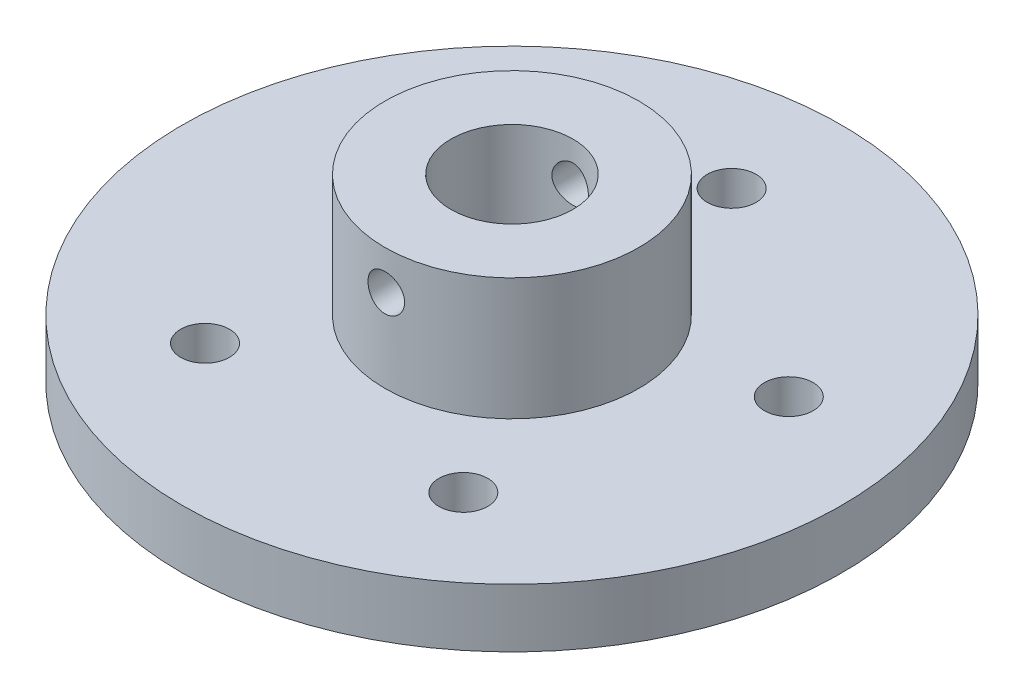
ISO-10303-21;
HEADER;
FILE_DESCRIPTION(('STEP AP214'),'2;1');
FILE_NAME('part.step','',(''),(''),'','','');
FILE_SCHEMA(('AUTOMOTIVE_DESIGN { 1 0 10303 214 1 1 1 1 }'));
ENDSEC;
DATA;
#1=APPLICATION_CONTEXT('core data for automotive mechanical design processes');
#2=APPLICATION_PROTOCOL_DEFINITION('international standard','automotive_design',2000,#1);
#3=PRODUCT_CONTEXT('',#1,'mechanical');
#4=PRODUCT('Part','Part','',(#3));
#5=PRODUCT_RELATED_PRODUCT_CATEGORY('part','',(#4));
#6=PRODUCT_DEFINITION_FORMATION('','',#4);
#7=PRODUCT_DEFINITION_CONTEXT('part definition',#1,'design');
#8=PRODUCT_DEFINITION('design','',#6,#7);
#9=PRODUCT_DEFINITION_SHAPE('','',#8);
#10=(LENGTH_UNIT() NAMED_UNIT(*) SI_UNIT(.MILLI.,.METRE.));
#11=(NAMED_UNIT(*) PLANE_ANGLE_UNIT() SI_UNIT($,.RADIAN.));
#12=(NAMED_UNIT(*) SI_UNIT($,.STERADIAN.) SOLID_ANGLE_UNIT());
#13=UNCERTAINTY_MEASURE_WITH_UNIT(LENGTH_MEASURE(1.E-05),#10,'distance_accuracy_value','');
#14=(GEOMETRIC_REPRESENTATION_CONTEXT(3) GLOBAL_UNCERTAINTY_ASSIGNED_CONTEXT((#13)) GLOBAL_UNIT_ASSIGNED_CONTEXT((#10,
#11,#12)) REPRESENTATION_CONTEXT('',''));
#15=CARTESIAN_POINT('',(0.,0.,0.));
#16=DIRECTION('',(0.,0.,1.));
#17=DIRECTION('',(1.,0.,0.));
#18=AXIS2_PLACEMENT_3D('',#15,#16,#17);
#19=CARTESIAN_POINT('',(0.,15.24,0.));
#20=DIRECTION('',(0.,1.,0.));
#21=DIRECTION('',(0.,0.,1.));
#22=AXIS2_PLACEMENT_3D('',#19,#20,#21);
#23=PLANE('',#22);
#24=CARTESIAN_POINT('',(-54.352879906268,15.24,-17.6603212285283));
#25=DIRECTION('',(0.,1.,0.));
#26=DIRECTION('',(0.,0.,1.));
#27=AXIS2_PLACEMENT_3D('',#24,#25,#26);
#28=CIRCLE('',#27,6.34999999999999);
#29=CARTESIAN_POINT('',(-54.352879906268,15.24,-11.3103212285283));
#30=VERTEX_POINT('',#29);
#31=EDGE_CURVE('E153',#30,#30,#28,.T.);
#32=ORIENTED_EDGE('',*,*,#31,.F.);
#33=EDGE_LOOP('',(#32));
#34=FACE_BOUND('',#33,.T.);
#35=CARTESIAN_POINT('',(0.,15.24,-57.15));
#36=DIRECTION('',(0.,1.,0.));
#37=DIRECTION('',(0.,0.,1.));
#38=AXIS2_PLACEMENT_3D('',#35,#36,#37);
#39=CIRCLE('',#38,6.34999999999999);
#40=CARTESIAN_POINT('',(0.,15.24,-50.8));
#41=VERTEX_POINT('',#40);
#42=EDGE_CURVE('E147',#41,#41,#39,.T.);
#43=ORIENTED_EDGE('',*,*,#42,.F.);
#44=EDGE_LOOP('',(#43));
#45=FACE_BOUND('',#44,.T.);
#46=CARTESIAN_POINT('',(54.352879906268,15.24,-17.6603212285283));
#47=DIRECTION('',(0.,1.,0.));
#48=DIRECTION('',(0.,0.,1.));
#49=AXIS2_PLACEMENT_3D('',#46,#47,#48);
#50=CIRCLE('',#49,6.34999999999999);
#51=CARTESIAN_POINT('',(54.352879906268,15.24,-11.3103212285283));
#52=VERTEX_POINT('',#51);
#53=EDGE_CURVE('E151',#52,#52,#50,.T.);
#54=ORIENTED_EDGE('',*,*,#53,.F.);
#55=EDGE_LOOP('',(#54));
#56=FACE_BOUND('',#55,.T.);
#57=CARTESIAN_POINT('',(33.5919271685148,15.24,46.2353212285282));
#58=DIRECTION('',(0.,1.,0.));
#59=DIRECTION('',(0.,0.,1.));
#60=AXIS2_PLACEMENT_3D('',#57,#58,#59);
#61=CIRCLE('',#60,6.34999999999999);
#62=CARTESIAN_POINT('',(33.5919271685148,15.24,52.5853212285282));
#63=VERTEX_POINT('',#62);
#64=EDGE_CURVE('E161',#63,#63,#61,.T.);
#65=ORIENTED_EDGE('',*,*,#64,.F.);
#66=EDGE_LOOP('',(#65));
#67=FACE_BOUND('',#66,.T.);
#68=CARTESIAN_POINT('',(-33.5919271685148,15.24,46.2353212285282));
#69=DIRECTION('',(0.,1.,0.));
#70=DIRECTION('',(0.,0.,1.));
#71=AXIS2_PLACEMENT_3D('',#68,#69,#70);
#72=CIRCLE('',#71,6.34999999999999);
#73=CARTESIAN_POINT('',(-33.5919271685148,15.24,52.5853212285282));
#74=VERTEX_POINT('',#73);
#75=EDGE_CURVE('E167',#74,#74,#72,.T.);
#76=ORIENTED_EDGE('',*,*,#75,.F.);
#77=EDGE_LOOP('',(#76));
#78=FACE_BOUND('',#77,.T.);
#79=CARTESIAN_POINT('',(0.,15.24,0.));
#80=DIRECTION('',(0.,1.,0.));
#81=DIRECTION('',(0.,0.,1.));
#82=AXIS2_PLACEMENT_3D('',#79,#80,#81);
#83=CIRCLE('',#82,85.725);
#84=CARTESIAN_POINT('',(0.,15.24,85.725));
#85=VERTEX_POINT('',#84);
#86=EDGE_CURVE('E61',#85,#85,#83,.T.);
#87=ORIENTED_EDGE('',*,*,#86,.T.);
#88=EDGE_LOOP('',(#87));
#89=FACE_BOUND('',#88,.T.);
#90=CARTESIAN_POINT('',(0.,15.24,0.));
#91=DIRECTION('',(0.,1.,0.));
#92=DIRECTION('',(0.,0.,1.));
#93=AXIS2_PLACEMENT_3D('',#90,#91,#92);
#94=CIRCLE('',#93,33.02);
#95=CARTESIAN_POINT('',(0.,15.24,33.02));
#96=VERTEX_POINT('',#95);
#97=EDGE_CURVE('E179',#96,#96,#94,.T.);
#98=ORIENTED_EDGE('',*,*,#97,.F.);
#99=EDGE_LOOP('',(#98));
#100=FACE_BOUND('',#99,.T.);
#101=ADVANCED_FACE('F43',(#34,#45,#56,#67,#78,#89,#100),#23,.T.);
#102=CARTESIAN_POINT('',(0.,7.80947580645162,0.));
#103=DIRECTION('',(0.,1.,0.));
#104=DIRECTION('',(0.,0.,1.));
#105=AXIS2_PLACEMENT_3D('',#102,#103,#104);
#106=CYLINDRICAL_SURFACE('',#105,85.725);
#107=ORIENTED_EDGE('',*,*,#86,.F.);
#108=EDGE_LOOP('',(#107));
#109=FACE_BOUND('',#108,.T.);
#110=CARTESIAN_POINT('',(0.,0.,0.));
#111=DIRECTION('',(0.,1.,0.));
#112=DIRECTION('',(0.,0.,1.));
#113=AXIS2_PLACEMENT_3D('',#110,#111,#112);
#114=CIRCLE('',#113,85.725);
#115=CARTESIAN_POINT('',(0.,0.,85.725));
#116=VERTEX_POINT('',#115);
#117=EDGE_CURVE('E56',#116,#116,#114,.T.);
#118=ORIENTED_EDGE('',*,*,#117,.T.);
#119=EDGE_LOOP('',(#118));
#120=FACE_BOUND('',#119,.T.);
#121=ADVANCED_FACE('F104',(#109,#120),#106,.T.);
#122=CARTESIAN_POINT('',(0.,0.,0.));
#123=DIRECTION('',(0.,1.,0.));
#124=DIRECTION('',(0.,0.,1.));
#125=AXIS2_PLACEMENT_3D('',#122,#123,#124);
#126=PLANE('',#125);
#127=CARTESIAN_POINT('',(-54.352879906268,0.,-17.6603212285283));
#128=DIRECTION('',(0.,1.,0.));
#129=DIRECTION('',(0.,0.,1.));
#130=AXIS2_PLACEMENT_3D('',#127,#128,#129);
#131=CIRCLE('',#130,6.34999999999999);
#132=CARTESIAN_POINT('',(-54.352879906268,0.,-11.3103212285283));
#133=VERTEX_POINT('',#132);
#134=EDGE_CURVE('E149',#133,#133,#131,.T.);
#135=ORIENTED_EDGE('',*,*,#134,.T.);
#136=EDGE_LOOP('',(#135));
#137=FACE_BOUND('',#136,.T.);
#138=CARTESIAN_POINT('',(0.,0.,-57.15));
#139=DIRECTION('',(0.,1.,0.));
#140=DIRECTION('',(0.,0.,1.));
#141=AXIS2_PLACEMENT_3D('',#138,#139,#140);
#142=CIRCLE('',#141,6.35);
#143=CARTESIAN_POINT('',(0.,0.,-50.8));
#144=VERTEX_POINT('',#143);
#145=EDGE_CURVE('E144',#144,#144,#142,.T.);
#146=ORIENTED_EDGE('',*,*,#145,.T.);
#147=EDGE_LOOP('',(#146));
#148=FACE_BOUND('',#147,.T.);
#149=CARTESIAN_POINT('',(54.352879906268,0.,-17.6603212285283));
#150=DIRECTION('',(0.,1.,0.));
#151=DIRECTION('',(0.,0.,1.));
#152=AXIS2_PLACEMENT_3D('',#149,#150,#151);
#153=CIRCLE('',#152,6.34999999999999);
#154=CARTESIAN_POINT('',(54.352879906268,0.,-11.3103212285283));
#155=VERTEX_POINT('',#154);
#156=EDGE_CURVE('E158',#155,#155,#153,.T.);
#157=ORIENTED_EDGE('',*,*,#156,.T.);
#158=EDGE_LOOP('',(#157));
#159=FACE_BOUND('',#158,.T.);
#160=CARTESIAN_POINT('',(33.5919271685148,0.,46.2353212285282));
#161=DIRECTION('',(0.,1.,0.));
#162=DIRECTION('',(0.,0.,1.));
#163=AXIS2_PLACEMENT_3D('',#160,#161,#162);
#164=CIRCLE('',#163,6.34999999999999);
#165=CARTESIAN_POINT('',(33.5919271685148,0.,52.5853212285282));
#166=VERTEX_POINT('',#165);
#167=EDGE_CURVE('E164',#166,#166,#164,.T.);
#168=ORIENTED_EDGE('',*,*,#167,.T.);
#169=EDGE_LOOP('',(#168));
#170=FACE_BOUND('',#169,.T.);
#171=CARTESIAN_POINT('',(-33.5919271685148,0.,46.2353212285282));
#172=DIRECTION('',(0.,1.,0.));
#173=DIRECTION('',(0.,0.,1.));
#174=AXIS2_PLACEMENT_3D('',#171,#172,#173);
#175=CIRCLE('',#174,6.34999999999999);
#176=CARTESIAN_POINT('',(-33.5919271685148,0.,52.5853212285282));
#177=VERTEX_POINT('',#176);
#178=EDGE_CURVE('E170',#177,#177,#175,.T.);
#179=ORIENTED_EDGE('',*,*,#178,.T.);
#180=EDGE_LOOP('',(#179));
#181=FACE_BOUND('',#180,.T.);
#182=ORIENTED_EDGE('',*,*,#117,.F.);
#183=EDGE_LOOP('',(#182));
#184=FACE_BOUND('',#183,.T.);
#185=CARTESIAN_POINT('',(0.,0.,0.));
#186=DIRECTION('',(0.,1.,0.));
#187=DIRECTION('',(0.,0.,1.));
#188=AXIS2_PLACEMENT_3D('',#185,#186,#187);
#189=CIRCLE('',#188,15.875);
#190=CARTESIAN_POINT('',(0.,0.,15.875));
#191=VERTEX_POINT('',#190);
#192=EDGE_CURVE('E10',#191,#191,#189,.T.);
#193=ORIENTED_EDGE('',*,*,#192,.T.);
#194=EDGE_LOOP('',(#193));
#195=FACE_BOUND('',#194,.T.);
#196=ADVANCED_FACE('F107',(#137,#148,#159,#170,#181,#184,#195),#126,.F.);
#197=CARTESIAN_POINT('',(0.,46.99,0.));
#198=DIRECTION('',(0.,1.,0.));
#199=DIRECTION('',(0.,0.,1.));
#200=AXIS2_PLACEMENT_3D('',#197,#198,#199);
#201=PLANE('',#200);
#202=CARTESIAN_POINT('',(0.,46.99,0.));
#203=DIRECTION('',(0.,1.,0.));
#204=DIRECTION('',(0.,0.,1.));
#205=AXIS2_PLACEMENT_3D('',#202,#203,#204);
#206=CIRCLE('',#205,33.02);
#207=CARTESIAN_POINT('',(0.,46.99,33.02));
#208=VERTEX_POINT('',#207);
#209=EDGE_CURVE('E176',#208,#208,#206,.T.);
#210=ORIENTED_EDGE('',*,*,#209,.T.);
#211=EDGE_LOOP('',(#210));
#212=FACE_BOUND('',#211,.T.);
#213=CARTESIAN_POINT('',(0.,46.99,0.));
#214=DIRECTION('',(0.,1.,0.));
#215=DIRECTION('',(0.,0.,1.));
#216=AXIS2_PLACEMENT_3D('',#213,#214,#215);
#217=CIRCLE('',#216,15.875);
#218=CARTESIAN_POINT('',(0.,46.99,15.875));
#219=VERTEX_POINT('',#218);
#220=EDGE_CURVE('E173',#219,#219,#217,.T.);
#221=ORIENTED_EDGE('',*,*,#220,.F.);
#222=EDGE_LOOP('',(#221));
#223=FACE_BOUND('',#222,.T.);
#224=ADVANCED_FACE('F98',(#212,#223),#201,.T.);
#225=CARTESIAN_POINT('',(0.,7.80947580645162,0.));
#226=DIRECTION('',(0.,1.,0.));
#227=DIRECTION('',(0.,0.,1.));
#228=AXIS2_PLACEMENT_3D('',#225,#226,#227);
#229=CYLINDRICAL_SURFACE('',#228,33.02);
#230=CARTESIAN_POINT('',(0.,32.0675,33.02));
#231=CARTESIAN_POINT('',(-0.26603094744688,32.0675110592998,33.0199958531323));
#232=CARTESIAN_POINT('',(-0.532219197204256,32.089865770711,33.0167512603797));
#233=CARTESIAN_POINT('',(-1.05716353278971,32.178675996113,33.0041201584808));
#234=CARTESIAN_POINT('',(-1.31591198729305,32.2451752176813,32.9947275623116));
#235=CARTESIAN_POINT('',(-1.81830310178529,32.4202530389781,32.9708566144752));
#236=CARTESIAN_POINT('',(-2.06195672055527,32.5288006864558,32.9563820044594));
#237=CARTESIAN_POINT('',(-2.52755116908513,32.7848203185796,32.9239490307575));
#238=CARTESIAN_POINT('',(-2.74949518132674,32.9322865862624,32.9059911788459));
#239=CARTESIAN_POINT('',(-3.16701771983894,33.2630966795248,32.8684451763602));
#240=CARTESIAN_POINT('',(-3.36241618035148,33.4466666809008,32.8488472203885));
#241=CARTESIAN_POINT('',(-3.71974804411932,33.8439868143039,32.8103071296905));
#242=CARTESIAN_POINT('',(-3.88167957921731,34.0577386299897,32.7913650316239));
#243=CARTESIAN_POINT('',(-4.16817485963279,34.5105553769822,32.7561859878388));
#244=CARTESIAN_POINT('',(-4.29256568139947,34.7497307856222,32.7399617092066));
#245=CARTESIAN_POINT('',(-4.49934365862681,35.2458517766804,32.7121882191762));
#246=CARTESIAN_POINT('',(-4.58173292959346,35.502796463367,32.7006387723252));
#247=CARTESIAN_POINT('',(-4.70161264763165,36.0252740402913,32.6836184655171));
#248=CARTESIAN_POINT('',(-4.73941042981103,36.2907350348289,32.6781060162727));
#249=CARTESIAN_POINT('',(-4.76998605984067,36.8242847789517,32.6736573767307));
#250=CARTESIAN_POINT('',(-4.76276630050625,37.0923733881152,32.6747208369042));
#251=CARTESIAN_POINT('',(-4.70376322244121,37.6214045079214,32.6832658157607));
#252=CARTESIAN_POINT('',(-4.65232126542665,37.882385998908,32.6906981700315));
#253=CARTESIAN_POINT('',(-4.50686797408299,38.3919738606286,32.7110667341879));
#254=CARTESIAN_POINT('',(-4.41285551895675,38.6405799053503,32.7240030889823));
#255=CARTESIAN_POINT('',(-4.18457195076634,39.1194038580301,32.7539767255185));
#256=CARTESIAN_POINT('',(-4.05015532539782,39.3495514287755,32.7710287851442));
#257=CARTESIAN_POINT('',(-3.74498275161219,39.7841536565799,32.8073016480313));
#258=CARTESIAN_POINT('',(-3.57422459571772,39.9886067516902,32.8265225830025));
#259=CARTESIAN_POINT('',(-3.19933791600927,40.3679955072814,32.8651850547283));
#260=CARTESIAN_POINT('',(-2.99491571313767,40.542641063757,32.8846269891812));
#261=CARTESIAN_POINT('',(-2.55950717887235,40.8551888217294,32.9213756729163));
#262=CARTESIAN_POINT('',(-2.3285207464682,40.9930908835026,32.9386824140789));
#263=CARTESIAN_POINT('',(-1.84629599386725,41.2282483924517,32.9692268618726));
#264=CARTESIAN_POINT('',(-1.59504712258958,41.32548249781,32.982462431064));
#265=CARTESIAN_POINT('',(-1.07955361476476,41.4762971920014,33.0033550671944));
#266=CARTESIAN_POINT('',(-0.815309791018889,41.5298805074076,33.0110124825602));
#267=CARTESIAN_POINT('',(-0.283832210004079,41.5914892382173,33.0198400986966));
#268=CARTESIAN_POINT('',(-0.0166456162986612,41.5999136815799,33.0210671168827));
#269=CARTESIAN_POINT('',(0.515326224970001,41.5720231690689,33.0170500401861));
#270=CARTESIAN_POINT('',(0.78011154089266,41.5357094908502,33.0118061301036));
#271=CARTESIAN_POINT('',(1.29856357922308,41.4197052970355,32.9954715797359));
#272=CARTESIAN_POINT('',(1.55227446362478,41.3402081667879,32.9844070126013));
#273=CARTESIAN_POINT('',(2.04276586419206,41.1402969231761,32.9576682130104));
#274=CARTESIAN_POINT('',(2.27954563723684,41.0198810151849,32.9419937783773));
#275=CARTESIAN_POINT('',(2.73121493288335,40.7406070390814,32.9076370616634));
#276=CARTESIAN_POINT('',(2.94594566492856,40.5814946161347,32.8889351636876));
#277=CARTESIAN_POINT('',(3.34579846162503,40.2296997489168,32.8506690021869));
#278=CARTESIAN_POINT('',(3.53091894077618,40.0370155081745,32.8311046925551));
#279=CARTESIAN_POINT('',(3.86773940370821,39.6217746830229,32.79313974191));
#280=CARTESIAN_POINT('',(4.01917261665001,39.399000650793,32.7747491588241));
#281=CARTESIAN_POINT('',(4.28246842934225,38.9309437754073,32.7413889753524));
#282=CARTESIAN_POINT('',(4.39433203361881,38.6856615038517,32.7264192881261));
#283=CARTESIAN_POINT('',(4.57489518897166,38.1803623358176,32.7016676679614));
#284=CARTESIAN_POINT('',(4.64373758653644,37.9203973608699,32.6918685837407));
#285=CARTESIAN_POINT('',(4.73676021913437,37.3924444098605,32.6785212045832));
#286=CARTESIAN_POINT('',(4.760943286463,37.1244569436807,32.6749725132469));
#287=CARTESIAN_POINT('',(4.76389719332539,36.5907238156289,32.6745417464125));
#288=CARTESIAN_POINT('',(4.74308737888128,36.3249804286565,32.6775981098639));
#289=CARTESIAN_POINT('',(4.65754225511338,35.800813755789,32.6898996441016));
#290=CARTESIAN_POINT('',(4.59280699563927,35.5423904615868,32.6991448078645));
#291=CARTESIAN_POINT('',(4.42139274281739,35.0403009584652,32.7227613333682));
#292=CARTESIAN_POINT('',(4.31474084229621,34.7966253345539,32.7371293833752));
#293=CARTESIAN_POINT('',(4.06256222996975,34.3305589582013,32.7693771127755));
#294=CARTESIAN_POINT('',(3.91703440322669,34.108168816463,32.7872568928792));
#295=CARTESIAN_POINT('',(3.58970308487681,33.6888521757943,32.8247122367423));
#296=CARTESIAN_POINT('',(3.40758843742756,33.4921697700559,32.8443014697537));
#297=CARTESIAN_POINT('',(3.01290991884172,33.1320057681314,32.8828527423314));
#298=CARTESIAN_POINT('',(2.80033895867458,32.9685319230697,32.9018146346091));
#299=CARTESIAN_POINT('',(2.34951978340651,32.6786919048045,32.9370838663177));
#300=CARTESIAN_POINT('',(2.1111468328138,32.552518095821,32.9533772578248));
#301=CARTESIAN_POINT('',(1.61647549441229,32.3421834481362,32.9813361511852));
#302=CARTESIAN_POINT('',(1.36019622166341,32.2579785657191,32.9930065019739));
#303=CARTESIAN_POINT('',(0.918934905598586,32.1533367677676,33.0077033125928));
#304=CARTESIAN_POINT('',(0.736692240807498,32.1211964377688,33.0122911914757));
#305=CARTESIAN_POINT('',(0.369658352183646,32.0782743293917,33.0184409592931));
#306=CARTESIAN_POINT('',(0.184867156559355,32.067492314799,33.0200028816935));
#307=CARTESIAN_POINT('',(0.,32.0675,33.02));
#308=B_SPLINE_CURVE_WITH_KNOTS('',3,(#230,#231,#232,#233,#234,#235,#236,#237,#238,#239,#240,
#241,#242,#243,#244,#245,#246,#247,#248,#249,#250,#251,#252,#253,#254,#255,#256,#257,#258,#259,
#260,#261,#262,#263,#264,#265,#266,#267,#268,#269,#270,#271,#272,#273,#274,#275,#276,#277,#278,
#279,#280,#281,#282,#283,#284,#285,#286,#287,#288,#289,#290,#291,#292,#293,#294,#295,#296,#297,
#298,#299,#300,#301,#302,#303,#304,#305,#306,#307),.UNSPECIFIED.,.T.,.F.,(4,2,2,2,2,2,2,2,2,2,2,
2,2,2,2,2,2,2,2,2,2,2,2,2,2,2,2,2,2,2,2,2,2,2,2,2,2,2,4),(0.,0.797417384518342,1.59562547368014,
2.39324710731692,3.19075163922141,3.99342121563534,4.79613558577488,5.60249295880238,
6.40880971374797,7.20953605857475,8.01021984279386,8.80477789479337,9.59935686715363,
10.3968324522872,11.1943564919567,11.9992474307743,12.8041414302891,13.6094572954252,
14.4147228540056,15.2128611386534,16.0109766301759,16.8055470950758,17.6001524129666,
18.4001290156715,19.2001484393106,20.0062939770324,20.8124190482298,21.6158530593678,
22.4192361149574,23.2151637194149,24.0110904205997,24.8065035182652,25.6019394303412,
26.4044507003281,27.2071490677199,28.0139176592743,28.8198378064629,29.3739760233614,
29.928108111683),.UNSPECIFIED.);
#309=CARTESIAN_POINT('',(0.,32.0675,33.02));
#310=VERTEX_POINT('',#309);
#311=EDGE_CURVE('E88',#310,#310,#308,.T.);
#312=ORIENTED_EDGE('',*,*,#311,.T.);
#313=EDGE_LOOP('',(#312));
#314=FACE_BOUND('',#313,.T.);
#315=CARTESIAN_POINT('',(4.7625,36.83,-32.6747455039821));
#316=CARTESIAN_POINT('',(4.76248892671494,37.0960147232058,-32.6747498148291));
#317=CARTESIAN_POINT('',(4.74013684985238,37.3621867933309,-32.6780291925627));
#318=CARTESIAN_POINT('',(4.6513380389032,37.887097518099,-32.6907844669982));
#319=CARTESIAN_POINT('',(4.58484753902549,38.1458285285696,-32.7002665138678));
#320=CARTESIAN_POINT('',(4.40979522546465,38.6481827367493,-32.724331319145));
#321=CARTESIAN_POINT('',(4.3012647767494,38.8918170409174,-32.7389102740869));
#322=CARTESIAN_POINT('',(4.04528566159547,39.3573790517352,-32.7715216876411));
#323=CARTESIAN_POINT('',(3.8978426707327,39.5793099174682,-32.7895536425122));
#324=CARTESIAN_POINT('',(3.56705622007763,39.9968469922957,-32.8271887690749));
#325=CARTESIAN_POINT('',(3.38348137280577,40.1922690441328,-32.84680155936));
#326=CARTESIAN_POINT('',(2.98614160115693,40.5496465279451,-32.8853024934538));
#327=CARTESIAN_POINT('',(2.77237505792614,40.711600164224,-32.9041905983364));
#328=CARTESIAN_POINT('',(2.31954510103581,40.998118801987,-32.9392141541201));
#329=CARTESIAN_POINT('',(2.0803737439672,41.122514871692,-32.9553370309259));
#330=CARTESIAN_POINT('',(1.58426154827203,41.329303664639,-32.9829071692124));
#331=CARTESIAN_POINT('',(1.32732157998348,41.411698443526,-32.9943546595125));
#332=CARTESIAN_POINT('',(0.80485969946539,41.5315893084504,-33.011216368692));
#333=CARTESIAN_POINT('',(0.539409807359531,41.5693933336912,-33.0166719488366));
#334=CARTESIAN_POINT('',(0.00588189416432446,41.599985298006,-33.0210767784087));
#335=CARTESIAN_POINT('',(-0.26219599062272,41.5927755595393,-33.0200263635092));
#336=CARTESIAN_POINT('',(-0.791270636687732,41.5337885949582,-33.0115707053716));
#337=CARTESIAN_POINT('',(-1.05230519277795,41.4823426333977,-33.0042126980105));
#338=CARTESIAN_POINT('',(-1.56199710726901,41.3368630354492,-32.9840212796801));
#339=CARTESIAN_POINT('',(-1.81065416673062,41.2428283710193,-32.9711877365382));
#340=CARTESIAN_POINT('',(-2.28954091960983,41.0144983149704,-32.9414059115004));
#341=CARTESIAN_POINT('',(-2.51970273830735,40.8800625092158,-32.9244433188121));
#342=CARTESIAN_POINT('',(-2.95432537795738,40.5748487271907,-32.8882956928444));
#343=CARTESIAN_POINT('',(-3.15878463188945,40.4040685368026,-32.8691105241971));
#344=CARTESIAN_POINT('',(-3.53814943071949,40.0291659120602,-32.8304532380743));
#345=CARTESIAN_POINT('',(-3.71276929175123,39.8247543747494,-32.8109800977407));
#346=CARTESIAN_POINT('',(-4.02527024245449,39.3893764453766,-32.7741122954539));
#347=CARTESIAN_POINT('',(-4.16315113701575,39.1584099122979,-32.7567176445394));
#348=CARTESIAN_POINT('',(-4.39829328535865,38.676191197694,-32.7259767831221));
#349=CARTESIAN_POINT('',(-4.49552677784585,38.424925291443,-32.7126333412044));
#350=CARTESIAN_POINT('',(-4.64633505620849,37.9093946610791,-32.6915558391299));
#351=CARTESIAN_POINT('',(-4.6999126760097,37.6451307819119,-32.6838214148668));
#352=CARTESIAN_POINT('',(-4.76149986330167,37.1136428581622,-32.6749061780347));
#353=CARTESIAN_POINT('',(-4.76991368200457,36.8464665975297,-32.6736672282496));
#354=CARTESIAN_POINT('',(-4.74200560793737,36.3145179499786,-32.6777290199197));
#355=CARTESIAN_POINT('',(-4.70568499513736,36.0497454944991,-32.6830295742623));
#356=CARTESIAN_POINT('',(-4.589681323807,35.5313626315813,-32.69951982148));
#357=CARTESIAN_POINT('',(-4.51019826837786,35.2777065277834,-32.7106823437785));
#358=CARTESIAN_POINT('',(-4.31033345307104,34.7873184859786,-32.7376164899943));
#359=CARTESIAN_POINT('',(-4.18994981443846,34.5505873260183,-32.7533883256342));
#360=CARTESIAN_POINT('',(-3.91072424956075,34.0989528023991,-32.7879015581588));
#361=CARTESIAN_POINT('',(-3.75161979612827,33.8842132986047,-32.8066629106931));
#362=CARTESIAN_POINT('',(-3.3998354539505,33.4843391090804,-32.8449805404706));
#363=CARTESIAN_POINT('',(-3.20715381414346,33.2992059682984,-32.8645368591308));
#364=CARTESIAN_POINT('',(-2.79190782242629,32.9623557808068,-32.9024218719099));
#365=CARTESIAN_POINT('',(-2.56912548799769,32.8109060847539,-32.9207399930129));
#366=CARTESIAN_POINT('',(-2.10104738612794,32.5475813828161,-32.9539219442797));
#367=CARTESIAN_POINT('',(-1.85575219639863,32.4357053617719,-32.9687858630487));
#368=CARTESIAN_POINT('',(-1.3504592755317,32.2551344830501,-32.9933381866221));
#369=CARTESIAN_POINT('',(-1.09051541035529,32.1862914063848,-33.0030443388818));
#370=CARTESIAN_POINT('',(-0.562607171692301,32.0932602711789,-33.0162618202885));
#371=CARTESIAN_POINT('',(-0.294643287281279,32.0690694952743,-33.0197735264045));
#372=CARTESIAN_POINT('',(0.239101257979842,32.0660921391002,-33.0202031601631));
#373=CARTESIAN_POINT('',(0.504879676239865,32.0868957260165,-33.0171806054753));
#374=CARTESIAN_POINT('',(1.02911801930895,32.1724406766587,-33.0050009025066));
#375=CARTESIAN_POINT('',(1.28757796251599,32.2371819299189,-32.9958437696489));
#376=CARTESIAN_POINT('',(1.78974441883794,32.4086230432947,-32.9724189550538));
#377=CARTESIAN_POINT('',(2.03346005406531,32.5152966476418,-32.9581544717601));
#378=CARTESIAN_POINT('',(2.49959746523598,32.7675311249817,-32.9260848390053));
#379=CARTESIAN_POINT('',(2.7220186553508,32.9130930674088,-32.9082795921762));
#380=CARTESIAN_POINT('',(3.14133624939167,33.2404630641886,-32.870916768272));
#381=CARTESIAN_POINT('',(3.33799466032525,33.4225744006905,-32.851345338175));
#382=CARTESIAN_POINT('',(3.69811178995425,33.8172362702669,-32.812760580252));
#383=CARTESIAN_POINT('',(3.86156269322982,34.029793948895,-32.7937473847057));
#384=CARTESIAN_POINT('',(4.1513766459789,34.480601185504,-32.7583266054874));
#385=CARTESIAN_POINT('',(4.27754355670651,34.718977904626,-32.7419330028861));
#386=CARTESIAN_POINT('',(4.48786427927328,35.2136569794163,-32.7137712958452));
#387=CARTESIAN_POINT('',(4.57206221044645,35.4699401864959,-32.7019983367959));
#388=CARTESIAN_POINT('',(4.67668541464194,35.9111831282774,-32.6871653651188));
#389=CARTESIAN_POINT('',(4.70881738982207,36.093402191327,-32.6825322353772));
#390=CARTESIAN_POINT('',(4.75172840695971,36.4603888650201,-32.6763208246471));
#391=CARTESIAN_POINT('',(4.7625076944063,36.6451564463391,-32.6747425085379));
#392=CARTESIAN_POINT('',(4.7625,36.83,-32.6747455039821));
#393=B_SPLINE_CURVE_WITH_KNOTS('',3,(#315,#316,#317,#318,#319,#320,#321,#322,#323,#324,#325,
#326,#327,#328,#329,#330,#331,#332,#333,#334,#335,#336,#337,#338,#339,#340,#341,#342,#343,#344,
#345,#346,#347,#348,#349,#350,#351,#352,#353,#354,#355,#356,#357,#358,#359,#360,#361,#362,#363,
#364,#365,#366,#367,#368,#369,#370,#371,#372,#373,#374,#375,#376,#377,#378,#379,#380,#381,#382,
#383,#384,#385,#386,#387,#388,#389,#390,#391,#392),.UNSPECIFIED.,.T.,.F.,(4,2,2,2,2,2,2,2,2,2,2,
2,2,2,2,2,2,2,2,2,2,2,2,2,2,2,2,2,2,2,2,2,2,2,2,2,2,2,4),(0.,0.797368638559685,1.59552909742427,
2.3930952118792,3.19054506182148,3.99327844544991,4.79605488733179,5.6023901474117,
6.4086859397003,7.20938031361456,8.01003337650202,8.80474242410945,9.59947065609325,
10.3969935519069,11.19456504712,11.9993899807593,12.8042191885107,13.6095971826434,
14.4149228914087,15.2130281380655,16.0111105493562,16.8055260315263,17.5999780098466,
18.399974258056,19.200012238835,20.0061899981291,20.8123470755379,21.6157119694644,
22.4190279721399,23.2150577769836,24.0110855805021,24.8066157464105,25.6021677917526,
26.4046165677084,27.2072539825598,28.0140415643541,28.8199792232169,29.3740468533396,
29.9281081133817),.UNSPECIFIED.);
#394=CARTESIAN_POINT('',(4.7625,36.83,-32.6747455039821));
#395=VERTEX_POINT('',#394);
#396=EDGE_CURVE('E82',#395,#395,#393,.T.);
#397=ORIENTED_EDGE('',*,*,#396,.T.);
#398=EDGE_LOOP('',(#397));
#399=FACE_BOUND('',#398,.T.);
#400=ORIENTED_EDGE('',*,*,#209,.F.);
#401=EDGE_LOOP('',(#400));
#402=FACE_BOUND('',#401,.T.);
#403=ORIENTED_EDGE('',*,*,#97,.T.);
#404=EDGE_LOOP('',(#403));
#405=FACE_BOUND('',#404,.T.);
#406=ADVANCED_FACE('F93',(#314,#399,#402,#405),#229,.T.);
#407=CARTESIAN_POINT('',(0.,7.80947580645162,0.));
#408=DIRECTION('',(0.,1.,0.));
#409=DIRECTION('',(0.,0.,1.));
#410=AXIS2_PLACEMENT_3D('',#407,#408,#409);
#411=CYLINDRICAL_SURFACE('',#410,15.875);
#412=CARTESIAN_POINT('',(0.,32.0675,15.875));
#413=CARTESIAN_POINT('',(-0.261266345491727,32.0675031670145,15.874997753705));
#414=CARTESIAN_POINT('',(-0.522564735766107,32.0890705170061,15.868488573283));
#415=CARTESIAN_POINT('',(-1.037552297843,32.1745652996552,15.8431581025997));
#416=CARTESIAN_POINT('',(-1.29123917650626,32.2385053667241,15.8243331401227));
#417=CARTESIAN_POINT('',(-1.78350134712062,32.4064186036901,15.7764337919333));
#418=CARTESIAN_POINT('',(-2.02209833195531,32.5103327110401,15.747374532951));
#419=CARTESIAN_POINT('',(-2.4784817748437,32.7550020954523,15.6820269682953));
#420=CARTESIAN_POINT('',(-2.69626545921621,32.8957622734804,15.6457377010982));
#421=CARTESIAN_POINT('',(-3.11109295605839,33.2143862237257,15.5686359058704));
#422=CARTESIAN_POINT('',(-3.30745487620077,33.3931152871878,15.5277306811104));
#423=CARTESIAN_POINT('',(-3.66791623931554,33.7807593049648,15.446560236182));
#424=CARTESIAN_POINT('',(-3.8320102533963,33.9896793284966,15.4062951247548));
#425=CARTESIAN_POINT('',(-4.12686619772767,34.4375446408945,15.3299831193004));
#426=CARTESIAN_POINT('',(-4.25679581145508,34.677059363646,15.2940514115709));
#427=CARTESIAN_POINT('',(-4.47425428409885,35.1757908821808,15.2318599475176));
#428=CARTESIAN_POINT('',(-4.56179332495993,35.4350029294698,15.2055978689741));
#429=CARTESIAN_POINT('',(-4.68952686942344,35.9581140949657,15.1666851490946));
#430=CARTESIAN_POINT('',(-4.73097848044824,36.2216787117735,15.1536739509592));
#431=CARTESIAN_POINT('',(-4.7692859470186,36.7523177709827,15.1416635746498));
#432=CARTESIAN_POINT('',(-4.76615260767456,37.019391347317,15.1426610015013));
#433=CARTESIAN_POINT('',(-4.71636652608321,37.5392439098608,15.1582356238118));
#434=CARTESIAN_POINT('',(-4.67128876705057,37.7921908949908,15.1723213367746));
#435=CARTESIAN_POINT('',(-4.54143809852037,38.2867528215045,15.2116903090124));
#436=CARTESIAN_POINT('',(-4.45666127148849,38.5283666419335,15.2369746733655));
#437=CARTESIAN_POINT('',(-4.24865884626643,38.9972561101451,15.2962842754707));
#438=CARTESIAN_POINT('',(-4.12492243767813,39.2242899915505,15.3304245117728));
#439=CARTESIAN_POINT('',(-3.84286831718747,39.6548991698898,15.4035438371607));
#440=CARTESIAN_POINT('',(-3.6845422245813,39.8584687633908,15.442524097942));
#441=CARTESIAN_POINT('',(-3.32998098180702,40.2453036556673,15.5229246087355));
#442=CARTESIAN_POINT('',(-3.13243883120789,40.4273660082936,15.5643787743653));
#443=CARTESIAN_POINT('',(-2.7091108483216,40.7560588994046,15.6436137490015));
#444=CARTESIAN_POINT('',(-2.48332323965825,40.9026872077159,15.6813943267077));
#445=CARTESIAN_POINT('',(-2.00772724673846,41.1570802538254,15.7493703322076));
#446=CARTESIAN_POINT('',(-1.75776810544976,41.2645781140933,15.7795132614695));
#447=CARTESIAN_POINT('',(-1.24220419454116,41.4356536985664,15.8284393181725));
#448=CARTESIAN_POINT('',(-0.976603811296916,41.4992436730907,15.8472256139371));
#449=CARTESIAN_POINT('',(-0.447523370471957,41.5786956648306,15.8708205774325));
#450=CARTESIAN_POINT('',(-0.18430905988377,41.5961880349201,15.8761065007649));
#451=CARTESIAN_POINT('',(0.341311248489243,41.5875179306141,15.8735053129258));
#452=CARTESIAN_POINT('',(0.60371734949323,41.5613612838567,15.8656199602688));
#453=CARTESIAN_POINT('',(1.11411894685829,41.467453859721,15.8378746293424));
#454=CARTESIAN_POINT('',(1.36230605304999,41.4006557444307,15.8182890961314));
#455=CARTESIAN_POINT('',(1.84389597868061,41.2285077359292,15.7694105439687));
#456=CARTESIAN_POINT('',(2.07729701705623,41.1231532087048,15.7401163581947));
#457=CARTESIAN_POINT('',(2.52868807653884,40.8741461995974,15.6740115256543));
#458=CARTESIAN_POINT('',(2.74619664818395,40.7296640924902,15.6370426663411));
#459=CARTESIAN_POINT('',(3.15443650283698,40.4075114058823,15.5598326332682));
#460=CARTESIAN_POINT('',(3.34516105273012,40.2298325072567,15.5195906406909));
#461=CARTESIAN_POINT('',(3.70159738949508,39.8386702959272,15.4385382068409));
#462=CARTESIAN_POINT('',(3.86614927910015,39.6241210444244,15.39776019479));
#463=CARTESIAN_POINT('',(4.15699559354097,39.1695687936323,15.3218043588374));
#464=CARTESIAN_POINT('',(4.28329102158607,38.9295664620287,15.2866263880958));
#465=CARTESIAN_POINT('',(4.49317577128726,38.4316843402653,15.2262582702177));
#466=CARTESIAN_POINT('',(4.57696401525009,38.1738943577424,15.2010217263168));
#467=CARTESIAN_POINT('',(4.69968995338111,37.6469656986465,15.1635331212433));
#468=CARTESIAN_POINT('',(4.73864301758085,37.3778309440139,15.1512766104765));
#469=CARTESIAN_POINT('',(4.76954800739764,36.8479021791168,15.1415741259472));
#470=CARTESIAN_POINT('',(4.76339075602721,36.5872279079181,15.1435323033688));
#471=CARTESIAN_POINT('',(4.70876329785669,36.070812721703,15.160605987976));
#472=CARTESIAN_POINT('',(4.66029478545935,35.8150716095519,15.1757209682824));
#473=CARTESIAN_POINT('',(4.52364121953789,35.3188733577569,15.2170054973042));
#474=CARTESIAN_POINT('',(4.43595682235119,35.0782658626361,15.2430354445408));
#475=CARTESIAN_POINT('',(4.22375035109409,34.6149852567442,15.3031913551586));
#476=CARTESIAN_POINT('',(4.09922122632084,34.392315588988,15.3373188678632));
#477=CARTESIAN_POINT('',(3.81154825081154,33.9624571050291,15.4113762265785));
#478=CARTESIAN_POINT('',(3.64716301595269,33.7561276829989,15.4514721502162));
#479=CARTESIAN_POINT('',(3.28667854949544,33.3733695678718,15.5321419242727));
#480=CARTESIAN_POINT('',(3.090571089402,33.1969486571897,15.5727158961547));
#481=CARTESIAN_POINT('',(2.66530379493185,32.8738756659635,15.6511922361225));
#482=CARTESIAN_POINT('',(2.43534528738519,32.7282446562339,15.6889818225613));
#483=CARTESIAN_POINT('',(1.95307386239769,32.4779158355547,15.7562766044709));
#484=CARTESIAN_POINT('',(1.70077146827168,32.3731988797284,15.7857856728111));
#485=CARTESIAN_POINT('',(1.20890573768052,32.2170574998025,15.8306190552756));
#486=CARTESIAN_POINT('',(0.970873604204693,32.1611254385957,15.847124369349));
#487=CARTESIAN_POINT('',(0.488569619857723,32.086348307358,15.8693149877001));
#488=CARTESIAN_POINT('',(0.244298818799592,32.0674970386622,15.875002100413));
#489=CARTESIAN_POINT('',(0.,32.0675,15.875));
#490=B_SPLINE_CURVE_WITH_KNOTS('',3,(#412,#413,#414,#415,#416,#417,#418,#419,#420,#421,#422,
#423,#424,#425,#426,#427,#428,#429,#430,#431,#432,#433,#434,#435,#436,#437,#438,#439,#440,#441,
#442,#443,#444,#445,#446,#447,#448,#449,#450,#451,#452,#453,#454,#455,#456,#457,#458,#459,#460,
#461,#462,#463,#464,#465,#466,#467,#468,#469,#470,#471,#472,#473,#474,#475,#476,#477,#478,#479,
#480,#481,#482,#483,#484,#485,#486,#487,#488,#489),.UNSPECIFIED.,.T.,.F.,(4,2,2,2,2,2,2,2,2,2,2,
2,2,2,2,2,2,2,2,2,2,2,2,2,2,2,2,2,2,2,2,2,2,2,2,2,2,2,4),(0.,0.782901671470039,1.56603688838605,
2.34801942225528,3.13010602201033,3.93241539360508,4.73485963391411,5.55534452188047,
6.37563223674736,7.17295013707201,7.97007481163109,8.73842603017835,9.50685308619295,
10.2858070397475,11.0649499350855,11.8766305535807,12.6883622449129,13.505530738545,
14.3224711495911,15.1101046997252,15.8976331002743,16.6673767072153,17.4372128584023,
18.2248589561188,19.0127027035575,19.8291577103009,20.645591305074,21.4581681247537,
22.2704663004154,23.0489174362008,23.827337399452,24.5960912829826,25.3649923725074,
26.161902390534,26.9590194531919,27.7794401281705,28.5994764433449,29.3316562189883,
30.063713588323),.UNSPECIFIED.);
#491=CARTESIAN_POINT('',(0.,32.0675,15.875));
#492=VERTEX_POINT('',#491);
#493=EDGE_CURVE('E48',#492,#492,#490,.T.);
#494=ORIENTED_EDGE('',*,*,#493,.F.);
#495=EDGE_LOOP('',(#494));
#496=FACE_BOUND('',#495,.T.);
#497=CARTESIAN_POINT('',(4.7625,36.83,-15.143784822494));
#498=CARTESIAN_POINT('',(4.76249674987405,37.0909676897198,-15.1437875218597));
#499=CARTESIAN_POINT('',(4.74097693430731,37.351967536658,-15.1506043891455));
#500=CARTESIAN_POINT('',(4.65568806118374,37.8663366674537,-15.1770263611095));
#501=CARTESIAN_POINT('',(4.59190488696096,38.119703372142,-15.1966357386656));
#502=CARTESIAN_POINT('',(4.42444991632123,38.6112852622629,-15.2462262539208));
#503=CARTESIAN_POINT('',(4.32084446326727,38.8495248840851,-15.2761901328282));
#504=CARTESIAN_POINT('',(4.07690389589421,39.305299640435,-15.3430901083847));
#505=CARTESIAN_POINT('',(3.93656328310142,39.5228316688231,-15.3800272485522));
#506=CARTESIAN_POINT('',(3.61838094399667,39.9379007900832,-15.4580228743982));
#507=CARTESIAN_POINT('',(3.43957932783187,40.1346857259795,-15.4991691638945));
#508=CARTESIAN_POINT('',(3.05160755431522,40.495975495449,-15.580196866492));
#509=CARTESIAN_POINT('',(2.84243349933903,40.6604761796784,-15.6200781164521));
#510=CARTESIAN_POINT('',(2.39430381499496,40.9557940719707,-15.6950795628956));
#511=CARTESIAN_POINT('',(2.15482176774121,41.0858443726059,-15.7300842478713));
#512=CARTESIAN_POINT('',(1.65615824904769,41.3035345474607,-15.7903683404817));
#513=CARTESIAN_POINT('',(1.39698104013162,41.3911835682974,-15.8156498453165));
#514=CARTESIAN_POINT('',(0.874153232102881,41.5190940034624,-15.8530177606139));
#515=CARTESIAN_POINT('',(0.610842691678317,41.5606392802973,-15.8654609464764));
#516=CARTESIAN_POINT('',(0.0807142904040691,41.5992225057524,-15.8770066476678));
#517=CARTESIAN_POINT('',(-0.186102822009932,41.5962698026012,-15.8761119650445));
#518=CARTESIAN_POINT('',(-0.706663422205502,41.5468026423759,-15.8613349212105));
#519=CARTESIAN_POINT('',(-0.960552649761227,41.5016785096537,-15.8478670915163));
#520=CARTESIAN_POINT('',(-1.45697325268006,41.3714205082181,-15.8099608270755));
#521=CARTESIAN_POINT('',(-1.69950390770017,41.2862841057568,-15.7855216975838));
#522=CARTESIAN_POINT('',(-2.16962776116519,41.0774768256463,-15.7278457663334));
#523=CARTESIAN_POINT('',(-2.39701408040447,40.9533686810879,-15.6945098122253));
#524=CARTESIAN_POINT('',(-2.82817783926203,40.6704868185394,-15.6225760905863));
#525=CARTESIAN_POINT('',(-3.0319496602209,40.5117048763374,-15.5839770755373));
#526=CARTESIAN_POINT('',(-3.41839702885516,40.1567721413673,-15.5038917279599));
#527=CARTESIAN_POINT('',(-3.59995654276612,39.9594167820944,-15.4623514513068));
#528=CARTESIAN_POINT('',(-3.92771793639682,39.5366556931853,-15.3823663615776));
#529=CARTESIAN_POINT('',(-4.07391630235831,39.3112471793376,-15.3439218563742));
#530=CARTESIAN_POINT('',(-4.3279693518785,38.8358396851754,-15.2742234259604));
#531=CARTESIAN_POINT('',(-4.43544290820137,38.5856256295572,-15.2430419874785));
#532=CARTESIAN_POINT('',(-4.60639677129299,38.069497113364,-15.1922604613002));
#533=CARTESIAN_POINT('',(-4.66989142981198,37.8035878054318,-15.1726565957717));
#534=CARTESIAN_POINT('',(-4.74899895648148,37.2742385046149,-15.1480789734703));
#535=CARTESIAN_POINT('',(-4.76630829757782,37.0110758891265,-15.1425871479299));
#536=CARTESIAN_POINT('',(-4.75729132464364,36.4855985424788,-15.1454228598876));
#537=CARTESIAN_POINT('',(-4.73097111878812,36.2232836977822,-15.1537484629337));
#538=CARTESIAN_POINT('',(-4.63695299348211,35.7140243999399,-15.1827724841554));
#539=CARTESIAN_POINT('',(-4.57034777544357,35.4668576784626,-15.2031438541227));
#540=CARTESIAN_POINT('',(-4.39891734349667,34.9872246316633,-15.2536252340815));
#541=CARTESIAN_POINT('',(-4.2940862283825,34.7547605826039,-15.2837367476479));
#542=CARTESIAN_POINT('',(-4.045961910489,34.3042320515708,-15.3513102619845));
#543=CARTESIAN_POINT('',(-3.90171191248417,34.08672151087,-15.3889478564668));
#544=CARTESIAN_POINT('',(-3.57998082581218,33.678374012876,-15.4669555292911));
#545=CARTESIAN_POINT('',(-3.40249178323296,33.4875434590794,-15.5073262601774));
#546=CARTESIAN_POINT('',(-3.01134504566719,33.1305522115382,-15.5880953651542));
#547=CARTESIAN_POINT('',(-2.79657513409736,32.9655943779663,-15.6284372807504));
#548=CARTESIAN_POINT('',(-2.34144116607404,32.6740307242369,-15.7030690430196));
#549=CARTESIAN_POINT('',(-2.10107838147702,32.5474229994439,-15.7373591902148));
#550=CARTESIAN_POINT('',(-1.60317022743907,32.3373749029456,-15.7958145625799));
#551=CARTESIAN_POINT('',(-1.34577017497014,32.2536120986952,-15.8200551462426));
#552=CARTESIAN_POINT('',(-0.819689643652059,32.1308065825229,-15.8560128521993));
#553=CARTESIAN_POINT('',(-0.551012415101356,32.0917510756138,-15.8677335575506));
#554=CARTESIAN_POINT('',(-0.0211205885777188,32.0604418351269,-15.8771127745843));
#555=CARTESIAN_POINT('',(0.239982943598664,32.0664436920801,-15.8752954372839));
#556=CARTESIAN_POINT('',(0.757299352697027,32.1209086831848,-15.8590381467654));
#557=CARTESIAN_POINT('',(1.01351250607539,32.1693694098006,-15.8445989092442));
#558=CARTESIAN_POINT('',(1.51109620640616,32.3062970249436,-15.8048695953749));
#559=CARTESIAN_POINT('',(1.75259659434009,32.3943287235598,-15.7796977045951));
#560=CARTESIAN_POINT('',(2.21752552986336,32.6075100785611,-15.7211059415099));
#561=CARTESIAN_POINT('',(2.44095109996279,32.7326658346616,-15.6876847139384));
#562=CARTESIAN_POINT('',(2.87115850843302,33.0211857273373,-15.6147759150177));
#563=CARTESIAN_POINT('',(3.07717904398516,33.1856442902407,-15.575128454715));
#564=CARTESIAN_POINT('',(3.45928178903196,33.5461304829683,-15.4947473065996));
#565=CARTESIAN_POINT('',(3.63535534551822,33.7421672053703,-15.4540133087578));
#566=CARTESIAN_POINT('',(3.95783655324734,34.1672569710954,-15.374641609628));
#567=CARTESIAN_POINT('',(4.10320362219627,34.397119906854,-15.3361025714441));
#568=CARTESIAN_POINT('',(4.3530619544192,34.8791376777983,-15.2670683818406));
#569=CARTESIAN_POINT('',(4.45757285891277,35.1312817298887,-15.2365693675568));
#570=CARTESIAN_POINT('',(4.61333667544683,35.6226758703835,-15.190083181138));
#571=CARTESIAN_POINT('',(4.6691187736135,35.8603824540149,-15.1728854162817));
#572=CARTESIAN_POINT('',(4.74369824800893,36.342050831415,-15.1497361023649));
#573=CARTESIAN_POINT('',(4.76250303866662,36.5860113612462,-15.1437822987541));
#574=CARTESIAN_POINT('',(4.7625,36.83,-15.143784822494));
#575=B_SPLINE_CURVE_WITH_KNOTS('',3,(#497,#498,#499,#500,#501,#502,#503,#504,#505,#506,#507,
#508,#509,#510,#511,#512,#513,#514,#515,#516,#517,#518,#519,#520,#521,#522,#523,#524,#525,#526,
#527,#528,#529,#530,#531,#532,#533,#534,#535,#536,#537,#538,#539,#540,#541,#542,#543,#544,#545,
#546,#547,#548,#549,#550,#551,#552,#553,#554,#555,#556,#557,#558,#559,#560,#561,#562,#563,#564,
#565,#566,#567,#568,#569,#570,#571,#572,#573,#574),.UNSPECIFIED.,.T.,.F.,(4,2,2,2,2,2,2,2,2,2,2,
2,2,2,2,2,2,2,2,2,2,2,2,2,2,2,2,2,2,2,2,2,2,2,2,2,2,2,4),(0.,0.78200302678185,1.56426738736258,
2.34523411593016,3.12631780555007,3.92979751275349,4.73338041991292,5.55358107193822,
6.3736047149151,7.17017044974846,7.96656884272074,8.73760400021045,9.50868798951945,
10.2887528964077,11.0690030267589,11.8793306679891,12.6897387966167,13.5079180643571,
14.3258302075348,15.113256565175,15.9005726917423,16.6674353893902,17.4344165232865,
18.2219832350308,19.009738648326,19.8272243187768,20.6446693826261,21.4558686901875,
22.2668357787961,23.046572649264,23.8262653093489,24.5975853257757,25.369032145184,
26.1651631590627,26.9615238210817,27.7816195595954,28.6013205584787,29.3325916350974,
30.063716067439),.UNSPECIFIED.);
#576=CARTESIAN_POINT('',(4.7625,36.83,-15.143784822494));
#577=VERTEX_POINT('',#576);
#578=EDGE_CURVE('E64',#577,#577,#575,.T.);
#579=ORIENTED_EDGE('',*,*,#578,.F.);
#580=EDGE_LOOP('',(#579));
#581=FACE_BOUND('',#580,.T.);
#582=ORIENTED_EDGE('',*,*,#220,.T.);
#583=EDGE_LOOP('',(#582));
#584=FACE_BOUND('',#583,.T.);
#585=ORIENTED_EDGE('',*,*,#192,.F.);
#586=EDGE_LOOP('',(#585));
#587=FACE_BOUND('',#586,.T.);
#588=ADVANCED_FACE('F45',(#496,#581,#584,#587),#411,.F.);
#589=CARTESIAN_POINT('',(-33.5919271685148,15.24,46.2353212285282));
#590=DIRECTION('',(0.,1.,0.));
#591=DIRECTION('',(0.,0.,1.));
#592=AXIS2_PLACEMENT_3D('',#589,#590,#591);
#593=CYLINDRICAL_SURFACE('',#592,6.34999999999999);
#594=ORIENTED_EDGE('',*,*,#178,.F.);
#595=EDGE_LOOP('',(#594));
#596=FACE_BOUND('',#595,.T.);
#597=ORIENTED_EDGE('',*,*,#75,.T.);
#598=EDGE_LOOP('',(#597));
#599=FACE_BOUND('',#598,.T.);
#600=ADVANCED_FACE('F111',(#596,#599),#593,.F.);
#601=CARTESIAN_POINT('',(33.5919271685148,15.24,46.2353212285282));
#602=DIRECTION('',(0.,1.,0.));
#603=DIRECTION('',(0.,0.,1.));
#604=AXIS2_PLACEMENT_3D('',#601,#602,#603);
#605=CYLINDRICAL_SURFACE('',#604,6.34999999999999);
#606=ORIENTED_EDGE('',*,*,#167,.F.);
#607=EDGE_LOOP('',(#606));
#608=FACE_BOUND('',#607,.T.);
#609=ORIENTED_EDGE('',*,*,#64,.T.);
#610=EDGE_LOOP('',(#609));
#611=FACE_BOUND('',#610,.T.);
#612=ADVANCED_FACE('F119',(#608,#611),#605,.F.);
#613=CARTESIAN_POINT('',(54.352879906268,15.24,-17.6603212285283));
#614=DIRECTION('',(0.,1.,0.));
#615=DIRECTION('',(0.,0.,1.));
#616=AXIS2_PLACEMENT_3D('',#613,#614,#615);
#617=CYLINDRICAL_SURFACE('',#616,6.34999999999999);
#618=ORIENTED_EDGE('',*,*,#156,.F.);
#619=EDGE_LOOP('',(#618));
#620=FACE_BOUND('',#619,.T.);
#621=ORIENTED_EDGE('',*,*,#53,.T.);
#622=EDGE_LOOP('',(#621));
#623=FACE_BOUND('',#622,.T.);
#624=ADVANCED_FACE('F125',(#620,#623),#617,.F.);
#625=CARTESIAN_POINT('',(0.,15.24,-57.15));
#626=DIRECTION('',(0.,1.,0.));
#627=DIRECTION('',(0.,0.,1.));
#628=AXIS2_PLACEMENT_3D('',#625,#626,#627);
#629=CYLINDRICAL_SURFACE('',#628,6.34999999999999);
#630=ORIENTED_EDGE('',*,*,#145,.F.);
#631=EDGE_LOOP('',(#630));
#632=FACE_BOUND('',#631,.T.);
#633=ORIENTED_EDGE('',*,*,#42,.T.);
#634=EDGE_LOOP('',(#633));
#635=FACE_BOUND('',#634,.T.);
#636=ADVANCED_FACE('F133',(#632,#635),#629,.F.);
#637=CARTESIAN_POINT('',(-54.352879906268,15.24,-17.6603212285283));
#638=DIRECTION('',(0.,1.,0.));
#639=DIRECTION('',(0.,0.,1.));
#640=AXIS2_PLACEMENT_3D('',#637,#638,#639);
#641=CYLINDRICAL_SURFACE('',#640,6.34999999999999);
#642=ORIENTED_EDGE('',*,*,#134,.F.);
#643=EDGE_LOOP('',(#642));
#644=FACE_BOUND('',#643,.T.);
#645=ORIENTED_EDGE('',*,*,#31,.T.);
#646=EDGE_LOOP('',(#645));
#647=FACE_BOUND('',#646,.T.);
#648=ADVANCED_FACE('F75',(#644,#647),#641,.F.);
#649=CARTESIAN_POINT('',(0.,36.83,-85.725));
#650=DIRECTION('',(0.,0.,1.));
#651=DIRECTION('',(1.,0.,0.));
#652=AXIS2_PLACEMENT_3D('',#649,#650,#651);
#653=CYLINDRICAL_SURFACE('',#652,4.7625);
#654=ORIENTED_EDGE('',*,*,#578,.T.);
#655=EDGE_LOOP('',(#654));
#656=FACE_BOUND('',#655,.T.);
#657=ORIENTED_EDGE('',*,*,#396,.F.);
#658=EDGE_LOOP('',(#657));
#659=FACE_BOUND('',#658,.T.);
#660=ADVANCED_FACE('F73',(#656,#659),#653,.F.);
#661=ORIENTED_EDGE('',*,*,#493,.T.);
#662=EDGE_LOOP('',(#661));
#663=FACE_BOUND('',#662,.T.);
#664=ORIENTED_EDGE('',*,*,#311,.F.);
#665=EDGE_LOOP('',(#664));
#666=FACE_BOUND('',#665,.T.);
#667=ADVANCED_FACE('F69',(#663,#666),#653,.F.);
#668=CLOSED_SHELL('',(#101,#121,#196,#224,#406,#588,#600,#612,#624,#636,#648,#660,#667));
#669=MANIFOLD_SOLID_BREP('B2',#668);
#670=ADVANCED_BREP_SHAPE_REPRESENTATION('',(#18,#669),#14);
#671=SHAPE_DEFINITION_REPRESENTATION(#9,#670);
ENDSEC;
END-ISO-10303-21;
